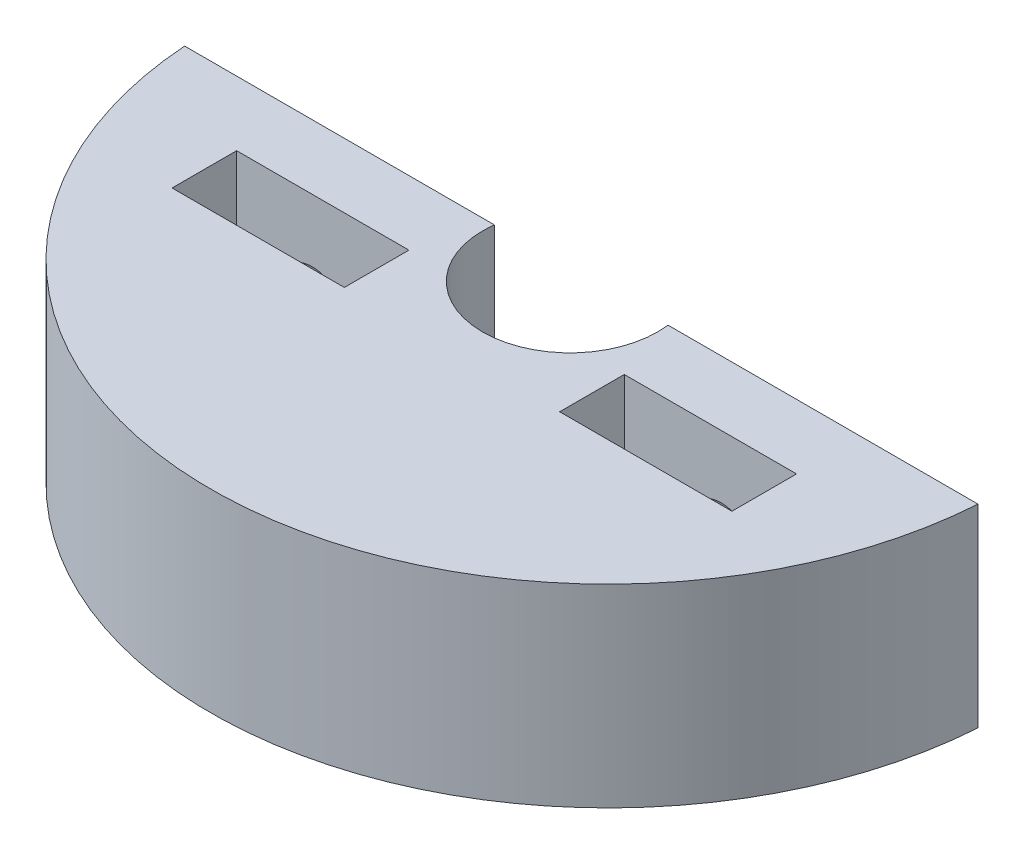
ISO-10303-21;
HEADER;
FILE_DESCRIPTION(('STEP AP214'),'2;1');
FILE_NAME('part.step','',(''),(''),'','','');
FILE_SCHEMA(('AUTOMOTIVE_DESIGN { 1 0 10303 214 1 1 1 1 }'));
ENDSEC;
DATA;
#1=APPLICATION_CONTEXT('core data for automotive mechanical design processes');
#2=APPLICATION_PROTOCOL_DEFINITION('international standard','automotive_design',2000,#1);
#3=PRODUCT_CONTEXT('',#1,'mechanical');
#4=PRODUCT('Part','Part','',(#3));
#5=PRODUCT_RELATED_PRODUCT_CATEGORY('part','',(#4));
#6=PRODUCT_DEFINITION_FORMATION('','',#4);
#7=PRODUCT_DEFINITION_CONTEXT('part definition',#1,'design');
#8=PRODUCT_DEFINITION('design','',#6,#7);
#9=PRODUCT_DEFINITION_SHAPE('','',#8);
#10=(LENGTH_UNIT() NAMED_UNIT(*) SI_UNIT(.MILLI.,.METRE.));
#11=(NAMED_UNIT(*) PLANE_ANGLE_UNIT() SI_UNIT($,.RADIAN.));
#12=(NAMED_UNIT(*) SI_UNIT($,.STERADIAN.) SOLID_ANGLE_UNIT());
#13=UNCERTAINTY_MEASURE_WITH_UNIT(LENGTH_MEASURE(1.E-05),#10,'distance_accuracy_value','');
#14=(GEOMETRIC_REPRESENTATION_CONTEXT(3) GLOBAL_UNCERTAINTY_ASSIGNED_CONTEXT((#13)) GLOBAL_UNIT_ASSIGNED_CONTEXT((#10,
#11,#12)) REPRESENTATION_CONTEXT('',''));
#15=CARTESIAN_POINT('',(0.,0.,0.));
#16=DIRECTION('',(0.,0.,1.));
#17=DIRECTION('',(1.,0.,0.));
#18=AXIS2_PLACEMENT_3D('',#15,#16,#17);
#19=CARTESIAN_POINT('',(43.755613948882,9.,-27.5186188295077));
#20=DIRECTION('',(0.,-1.,0.));
#21=DIRECTION('',(0.,0.,-1.));
#22=AXIS2_PLACEMENT_3D('',#19,#20,#21);
#23=CYLINDRICAL_SURFACE('',#22,18.4634264798173);
#24=CARTESIAN_POINT('',(43.755613948882,0.,-27.5186188295077));
#25=DIRECTION('',(0.,1.,0.));
#26=DIRECTION('',(0.,0.,1.));
#27=AXIS2_PLACEMENT_3D('',#24,#25,#26);
#28=CIRCLE('',#27,18.4634264798173);
#29=CARTESIAN_POINT('',(25.3345494471867,0.,-26.2686188295077));
#30=VERTEX_POINT('',#29);
#31=CARTESIAN_POINT('',(62.1766784505773,0.,-26.2686188295077));
#32=VERTEX_POINT('',#31);
#33=EDGE_CURVE('E200',#30,#32,#28,.T.);
#34=ORIENTED_EDGE('',*,*,#33,.T.);
#35=DIRECTION('',(0.,-1.,0.));
#36=VECTOR('',#35,1.);
#37=CARTESIAN_POINT('',(62.1766784505773,9.,-26.2686188295077));
#38=LINE('',#37,#36);
#39=CARTESIAN_POINT('',(62.1766784505773,9.,-26.2686188295077));
#40=VERTEX_POINT('',#39);
#41=EDGE_CURVE('E217',#40,#32,#38,.T.);
#42=ORIENTED_EDGE('',*,*,#41,.F.);
#43=CARTESIAN_POINT('',(43.755613948882,9.,-27.5186188295077));
#44=DIRECTION('',(0.,1.,0.));
#45=DIRECTION('',(0.,0.,1.));
#46=AXIS2_PLACEMENT_3D('',#43,#44,#45);
#47=CIRCLE('',#46,18.4634264798173);
#48=CARTESIAN_POINT('',(25.3345494471867,9.,-26.2686188295077));
#49=VERTEX_POINT('',#48);
#50=EDGE_CURVE('E189',#49,#40,#47,.T.);
#51=ORIENTED_EDGE('',*,*,#50,.F.);
#52=DIRECTION('',(0.,-1.,0.));
#53=VECTOR('',#52,1.);
#54=CARTESIAN_POINT('',(25.3345494471867,9.,-26.2686188295077));
#55=LINE('',#54,#53);
#56=EDGE_CURVE('E199',#49,#30,#55,.T.);
#57=ORIENTED_EDGE('',*,*,#56,.T.);
#58=EDGE_LOOP('',(#34,#42,#51,#57));
#59=FACE_BOUND('',#58,.T.);
#60=ADVANCED_FACE('F37',(#59),#23,.T.);
#61=CARTESIAN_POINT('',(47.7809975474761,9.,-26.2686188295077));
#62=DIRECTION('',(0.,0.,1.));
#63=DIRECTION('',(1.,0.,0.));
#64=AXIS2_PLACEMENT_3D('',#61,#62,#63);
#65=PLANE('',#64);
#66=CARTESIAN_POINT('',(53.2556139574761,4.50195927722872,-26.2686188295077));
#67=DIRECTION('',(0.,0.,1.));
#68=DIRECTION('',(1.,0.,0.));
#69=AXIS2_PLACEMENT_3D('',#66,#67,#68);
#70=CIRCLE('',#69,1.585);
#71=CARTESIAN_POINT('',(54.8406139574761,4.50195927722872,-26.2686188295077));
#72=VERTEX_POINT('',#71);
#73=EDGE_CURVE('E204',#72,#72,#70,.F.);
#74=ORIENTED_EDGE('',*,*,#73,.F.);
#75=EDGE_LOOP('',(#74));
#76=FACE_BOUND('',#75,.T.);
#77=DIRECTION('',(-1.,0.,0.));
#78=VECTOR('',#77,1.);
#79=CARTESIAN_POINT('',(47.7809975474761,0.,-26.2686188295077));
#80=LINE('',#79,#78);
#81=CARTESIAN_POINT('',(47.7809975474761,0.,-26.2686188295077));
#82=VERTEX_POINT('',#81);
#83=EDGE_CURVE('E203',#32,#82,#80,.T.);
#84=ORIENTED_EDGE('',*,*,#83,.T.);
#85=DIRECTION('',(0.,-1.,0.));
#86=VECTOR('',#85,1.);
#87=CARTESIAN_POINT('',(47.7809975474761,9.,-26.2686188295077));
#88=LINE('',#87,#86);
#89=CARTESIAN_POINT('',(47.7809975474761,9.,-26.2686188295077));
#90=VERTEX_POINT('',#89);
#91=EDGE_CURVE('E214',#90,#82,#88,.T.);
#92=ORIENTED_EDGE('',*,*,#91,.F.);
#93=DIRECTION('',(-1.,0.,0.));
#94=VECTOR('',#93,1.);
#95=CARTESIAN_POINT('',(47.7809975474761,9.,-26.2686188295077));
#96=LINE('',#95,#94);
#97=EDGE_CURVE('E192',#40,#90,#96,.T.);
#98=ORIENTED_EDGE('',*,*,#97,.F.);
#99=ORIENTED_EDGE('',*,*,#41,.T.);
#100=EDGE_LOOP('',(#84,#92,#98,#99));
#101=FACE_BOUND('',#100,.T.);
#102=ADVANCED_FACE('F252',(#76,#101),#65,.F.);
#103=CARTESIAN_POINT('',(43.7497527201918,9.,-25.7517945764645));
#104=DIRECTION('',(0.,-1.,0.));
#105=DIRECTION('',(0.,0.,-1.));
#106=AXIS2_PLACEMENT_3D('',#103,#104,#105);
#107=CYLINDRICAL_SURFACE('',#106,4.06423943266635);
#108=CARTESIAN_POINT('',(43.7497527201918,0.,-25.7517945764645));
#109=DIRECTION('',(0.,-1.,0.));
#110=DIRECTION('',(0.,0.,1.));
#111=AXIS2_PLACEMENT_3D('',#108,#109,#110);
#112=CIRCLE('',#111,4.06423943266635);
#113=CARTESIAN_POINT('',(39.7185078929075,0.,-26.2686188295077));
#114=VERTEX_POINT('',#113);
#115=EDGE_CURVE('E206',#82,#114,#112,.T.);
#116=ORIENTED_EDGE('',*,*,#115,.T.);
#117=DIRECTION('',(0.,-1.,0.));
#118=VECTOR('',#117,1.);
#119=CARTESIAN_POINT('',(39.7185078929075,9.,-26.2686188295077));
#120=LINE('',#119,#118);
#121=CARTESIAN_POINT('',(39.7185078929075,9.,-26.2686188295077));
#122=VERTEX_POINT('',#121);
#123=EDGE_CURVE('E211',#122,#114,#120,.T.);
#124=ORIENTED_EDGE('',*,*,#123,.F.);
#125=CARTESIAN_POINT('',(43.7497527201918,9.,-25.7517945764645));
#126=DIRECTION('',(0.,-1.,0.));
#127=DIRECTION('',(0.,0.,1.));
#128=AXIS2_PLACEMENT_3D('',#125,#126,#127);
#129=CIRCLE('',#128,4.06423943266635);
#130=EDGE_CURVE('E195',#90,#122,#129,.T.);
#131=ORIENTED_EDGE('',*,*,#130,.F.);
#132=ORIENTED_EDGE('',*,*,#91,.T.);
#133=EDGE_LOOP('',(#116,#124,#131,#132));
#134=FACE_BOUND('',#133,.T.);
#135=ADVANCED_FACE('F257',(#134),#107,.F.);
#136=CARTESIAN_POINT('',(25.3345494471867,9.,-26.2686188295077));
#137=DIRECTION('',(0.,0.,1.));
#138=DIRECTION('',(1.,0.,0.));
#139=AXIS2_PLACEMENT_3D('',#136,#137,#138);
#140=PLANE('',#139);
#141=CARTESIAN_POINT('',(34.2556139529075,4.50195927722872,-26.2686188295077));
#142=DIRECTION('',(0.,0.,1.));
#143=DIRECTION('',(1.,0.,0.));
#144=AXIS2_PLACEMENT_3D('',#141,#142,#143);
#145=CIRCLE('',#144,1.585);
#146=CARTESIAN_POINT('',(35.8406139529075,4.50195927722872,-26.2686188295077));
#147=VERTEX_POINT('',#146);
#148=EDGE_CURVE('E188',#147,#147,#145,.F.);
#149=ORIENTED_EDGE('',*,*,#148,.F.);
#150=EDGE_LOOP('',(#149));
#151=FACE_BOUND('',#150,.T.);
#152=DIRECTION('',(-1.,0.,0.));
#153=VECTOR('',#152,1.);
#154=CARTESIAN_POINT('',(25.3345494471867,0.,-26.2686188295077));
#155=LINE('',#154,#153);
#156=EDGE_CURVE('E193',#114,#30,#155,.T.);
#157=ORIENTED_EDGE('',*,*,#156,.T.);
#158=ORIENTED_EDGE('',*,*,#56,.F.);
#159=DIRECTION('',(-1.,0.,0.));
#160=VECTOR('',#159,1.);
#161=CARTESIAN_POINT('',(25.3345494471867,9.,-26.2686188295077));
#162=LINE('',#161,#160);
#163=EDGE_CURVE('E197',#122,#49,#162,.T.);
#164=ORIENTED_EDGE('',*,*,#163,.F.);
#165=ORIENTED_EDGE('',*,*,#123,.T.);
#166=EDGE_LOOP('',(#157,#158,#164,#165));
#167=FACE_BOUND('',#166,.T.);
#168=ADVANCED_FACE('F273',(#151,#167),#140,.F.);
#169=CARTESIAN_POINT('',(43.755613948882,9.,-27.5186188295077));
#170=DIRECTION('',(0.,1.,0.));
#171=DIRECTION('',(0.,0.,1.));
#172=AXIS2_PLACEMENT_3D('',#169,#170,#171);
#173=PLANE('',#172);
#174=DIRECTION('',(0.,0.,1.));
#175=VECTOR('',#174,1.);
#176=CARTESIAN_POINT('',(48.7497527201918,9.,-23.2686188295077));
#177=LINE('',#176,#175);
#178=CARTESIAN_POINT('',(48.7497527201918,9.,-23.2686188295077));
#179=VERTEX_POINT('',#178);
#180=CARTESIAN_POINT('',(48.7497527201918,9.,-20.2686188295077));
#181=VERTEX_POINT('',#180);
#182=EDGE_CURVE('E51',#179,#181,#177,.T.);
#183=ORIENTED_EDGE('',*,*,#182,.F.);
#184=DIRECTION('',(-1.,0.,0.));
#185=VECTOR('',#184,1.);
#186=CARTESIAN_POINT('',(48.7497527201918,9.,-23.2686188295077));
#187=LINE('',#186,#185);
#188=CARTESIAN_POINT('',(56.7497527201918,9.,-23.2686188295077));
#189=VERTEX_POINT('',#188);
#190=EDGE_CURVE('E148',#189,#179,#187,.T.);
#191=ORIENTED_EDGE('',*,*,#190,.F.);
#192=DIRECTION('',(0.,0.,-1.));
#193=VECTOR('',#192,1.);
#194=CARTESIAN_POINT('',(56.7497527201918,9.,-23.2686188295077));
#195=LINE('',#194,#193);
#196=CARTESIAN_POINT('',(56.7497527201918,9.,-20.2686188295077));
#197=VERTEX_POINT('',#196);
#198=EDGE_CURVE('E132',#197,#189,#195,.T.);
#199=ORIENTED_EDGE('',*,*,#198,.F.);
#200=DIRECTION('',(1.,0.,0.));
#201=VECTOR('',#200,1.);
#202=CARTESIAN_POINT('',(48.7497527201918,9.,-20.2686188295077));
#203=LINE('',#202,#201);
#204=EDGE_CURVE('E141',#181,#197,#203,.T.);
#205=ORIENTED_EDGE('',*,*,#204,.F.);
#206=EDGE_LOOP('',(#183,#191,#199,#205));
#207=FACE_BOUND('',#206,.T.);
#208=DIRECTION('',(0.,0.,-1.));
#209=VECTOR('',#208,1.);
#210=CARTESIAN_POINT('',(38.7497527201918,9.,-23.2686188295077));
#211=LINE('',#210,#209);
#212=CARTESIAN_POINT('',(38.7497527201918,9.,-20.2686188295077));
#213=VERTEX_POINT('',#212);
#214=CARTESIAN_POINT('',(38.7497527201918,9.,-23.2686188295077));
#215=VERTEX_POINT('',#214);
#216=EDGE_CURVE('E59',#213,#215,#211,.T.);
#217=ORIENTED_EDGE('',*,*,#216,.F.);
#218=DIRECTION('',(1.,0.,0.));
#219=VECTOR('',#218,1.);
#220=CARTESIAN_POINT('',(38.7497527201918,9.,-20.2686188295077));
#221=LINE('',#220,#219);
#222=CARTESIAN_POINT('',(30.7497527201918,9.,-20.2686188295077));
#223=VERTEX_POINT('',#222);
#224=EDGE_CURVE('E160',#223,#213,#221,.T.);
#225=ORIENTED_EDGE('',*,*,#224,.F.);
#226=DIRECTION('',(0.,0.,1.));
#227=VECTOR('',#226,1.);
#228=CARTESIAN_POINT('',(30.7497527201918,9.,-23.2686188295077));
#229=LINE('',#228,#227);
#230=CARTESIAN_POINT('',(30.7497527201918,9.,-23.2686188295077));
#231=VERTEX_POINT('',#230);
#232=EDGE_CURVE('E169',#231,#223,#229,.T.);
#233=ORIENTED_EDGE('',*,*,#232,.F.);
#234=DIRECTION('',(-1.,0.,0.));
#235=VECTOR('',#234,1.);
#236=CARTESIAN_POINT('',(38.7497527201918,9.,-23.2686188295077));
#237=LINE('',#236,#235);
#238=EDGE_CURVE('E172',#215,#231,#237,.T.);
#239=ORIENTED_EDGE('',*,*,#238,.F.);
#240=EDGE_LOOP('',(#217,#225,#233,#239));
#241=FACE_BOUND('',#240,.T.);
#242=ORIENTED_EDGE('',*,*,#50,.T.);
#243=ORIENTED_EDGE('',*,*,#97,.T.);
#244=ORIENTED_EDGE('',*,*,#130,.T.);
#245=ORIENTED_EDGE('',*,*,#163,.T.);
#246=EDGE_LOOP('',(#242,#243,#244,#245));
#247=FACE_BOUND('',#246,.T.);
#248=ADVANCED_FACE('F145',(#207,#241,#247),#173,.T.);
#249=CARTESIAN_POINT('',(43.755613948882,0.,-27.5186188295077));
#250=DIRECTION('',(0.,1.,0.));
#251=DIRECTION('',(0.,0.,1.));
#252=AXIS2_PLACEMENT_3D('',#249,#250,#251);
#253=PLANE('',#252);
#254=DIRECTION('',(-1.,0.,0.));
#255=VECTOR('',#254,1.);
#256=CARTESIAN_POINT('',(43.755613948882,0.,-23.2686188295077));
#257=LINE('',#256,#255);
#258=CARTESIAN_POINT('',(56.7497527201918,0.,-23.2686188295077));
#259=VERTEX_POINT('',#258);
#260=CARTESIAN_POINT('',(48.7497527201918,0.,-23.2686188295077));
#261=VERTEX_POINT('',#260);
#262=EDGE_CURVE('E178',#259,#261,#257,.T.);
#263=ORIENTED_EDGE('',*,*,#262,.T.);
#264=DIRECTION('',(0.,0.,1.));
#265=VECTOR('',#264,1.);
#266=CARTESIAN_POINT('',(48.7497527201918,0.,-27.5186188295077));
#267=LINE('',#266,#265);
#268=CARTESIAN_POINT('',(48.7497527201918,0.,-20.2686188295077));
#269=VERTEX_POINT('',#268);
#270=EDGE_CURVE('E11',#261,#269,#267,.T.);
#271=ORIENTED_EDGE('',*,*,#270,.T.);
#272=DIRECTION('',(1.,0.,0.));
#273=VECTOR('',#272,1.);
#274=CARTESIAN_POINT('',(43.755613948882,0.,-20.2686188295077));
#275=LINE('',#274,#273);
#276=CARTESIAN_POINT('',(56.7497527201918,0.,-20.2686188295077));
#277=VERTEX_POINT('',#276);
#278=EDGE_CURVE('E155',#269,#277,#275,.T.);
#279=ORIENTED_EDGE('',*,*,#278,.T.);
#280=DIRECTION('',(0.,0.,-1.));
#281=VECTOR('',#280,1.);
#282=CARTESIAN_POINT('',(56.7497527201918,0.,-27.5186188295077));
#283=LINE('',#282,#281);
#284=EDGE_CURVE('E44',#277,#259,#283,.T.);
#285=ORIENTED_EDGE('',*,*,#284,.T.);
#286=EDGE_LOOP('',(#263,#271,#279,#285));
#287=FACE_BOUND('',#286,.T.);
#288=DIRECTION('',(1.,0.,0.));
#289=VECTOR('',#288,1.);
#290=CARTESIAN_POINT('',(43.755613948882,0.,-20.2686188295077));
#291=LINE('',#290,#289);
#292=CARTESIAN_POINT('',(30.7497527201918,0.,-20.2686188295077));
#293=VERTEX_POINT('',#292);
#294=CARTESIAN_POINT('',(38.7497527201918,0.,-20.2686188295077));
#295=VERTEX_POINT('',#294);
#296=EDGE_CURVE('E185',#293,#295,#291,.T.);
#297=ORIENTED_EDGE('',*,*,#296,.T.);
#298=DIRECTION('',(0.,0.,-1.));
#299=VECTOR('',#298,1.);
#300=CARTESIAN_POINT('',(38.7497527201918,0.,-27.5186188295077));
#301=LINE('',#300,#299);
#302=CARTESIAN_POINT('',(38.7497527201918,0.,-23.2686188295077));
#303=VERTEX_POINT('',#302);
#304=EDGE_CURVE('E231',#295,#303,#301,.T.);
#305=ORIENTED_EDGE('',*,*,#304,.T.);
#306=DIRECTION('',(-1.,0.,0.));
#307=VECTOR('',#306,1.);
#308=CARTESIAN_POINT('',(43.755613948882,0.,-23.2686188295077));
#309=LINE('',#308,#307);
#310=CARTESIAN_POINT('',(30.7497527201918,0.,-23.2686188295077));
#311=VERTEX_POINT('',#310);
#312=EDGE_CURVE('E182',#303,#311,#309,.T.);
#313=ORIENTED_EDGE('',*,*,#312,.T.);
#314=DIRECTION('',(0.,0.,1.));
#315=VECTOR('',#314,1.);
#316=CARTESIAN_POINT('',(30.7497527201918,0.,-27.5186188295077));
#317=LINE('',#316,#315);
#318=EDGE_CURVE('E220',#311,#293,#317,.T.);
#319=ORIENTED_EDGE('',*,*,#318,.T.);
#320=EDGE_LOOP('',(#297,#305,#313,#319));
#321=FACE_BOUND('',#320,.T.);
#322=ORIENTED_EDGE('',*,*,#33,.F.);
#323=ORIENTED_EDGE('',*,*,#156,.F.);
#324=ORIENTED_EDGE('',*,*,#115,.F.);
#325=ORIENTED_EDGE('',*,*,#83,.F.);
#326=EDGE_LOOP('',(#322,#323,#324,#325));
#327=FACE_BOUND('',#326,.T.);
#328=ADVANCED_FACE('F234',(#287,#321,#327),#253,.F.);
#329=CARTESIAN_POINT('',(34.2556139529075,4.50195927722872,-20.2686188295077));
#330=DIRECTION('',(0.,0.,-1.));
#331=DIRECTION('',(-1.,0.,0.));
#332=AXIS2_PLACEMENT_3D('',#329,#330,#331);
#333=CYLINDRICAL_SURFACE('',#332,1.585);
#334=CARTESIAN_POINT('',(34.2556139529075,4.50195927722872,-23.2686188295077));
#335=DIRECTION('',(0.,0.,-1.));
#336=DIRECTION('',(-1.,0.,0.));
#337=AXIS2_PLACEMENT_3D('',#334,#335,#336);
#338=CIRCLE('',#337,1.585);
#339=CARTESIAN_POINT('',(32.6706139529075,4.50195927722872,-23.2686188295077));
#340=VERTEX_POINT('',#339);
#341=EDGE_CURVE('E181',#340,#340,#338,.T.);
#342=ORIENTED_EDGE('',*,*,#341,.F.);
#343=EDGE_LOOP('',(#342));
#344=FACE_BOUND('',#343,.T.);
#345=ORIENTED_EDGE('',*,*,#148,.T.);
#346=EDGE_LOOP('',(#345));
#347=FACE_BOUND('',#346,.T.);
#348=ADVANCED_FACE('F285',(#344,#347),#333,.F.);
#349=CARTESIAN_POINT('',(53.2556139574761,4.50195927722872,-20.2686188295077));
#350=DIRECTION('',(0.,0.,-1.));
#351=DIRECTION('',(-1.,0.,0.));
#352=AXIS2_PLACEMENT_3D('',#349,#350,#351);
#353=CYLINDRICAL_SURFACE('',#352,1.585);
#354=CARTESIAN_POINT('',(53.2556139574761,4.50195927722872,-23.2686188295077));
#355=DIRECTION('',(0.,0.,-1.));
#356=DIRECTION('',(-1.,0.,0.));
#357=AXIS2_PLACEMENT_3D('',#354,#355,#356);
#358=CIRCLE('',#357,1.585);
#359=CARTESIAN_POINT('',(51.6706139574761,4.50195927722872,-23.2686188295077));
#360=VERTEX_POINT('',#359);
#361=EDGE_CURVE('E177',#360,#360,#358,.T.);
#362=ORIENTED_EDGE('',*,*,#361,.F.);
#363=EDGE_LOOP('',(#362));
#364=FACE_BOUND('',#363,.T.);
#365=ORIENTED_EDGE('',*,*,#73,.T.);
#366=EDGE_LOOP('',(#365));
#367=FACE_BOUND('',#366,.T.);
#368=ADVANCED_FACE('F295',(#364,#367),#353,.F.);
#369=CARTESIAN_POINT('',(48.7497527201918,-23.,-23.2686188295077));
#370=DIRECTION('',(-1.,0.,0.));
#371=DIRECTION('',(0.,0.,1.));
#372=AXIS2_PLACEMENT_3D('',#369,#370,#371);
#373=PLANE('',#372);
#374=DIRECTION('',(0.,1.,0.));
#375=VECTOR('',#374,1.);
#376=CARTESIAN_POINT('',(48.7497527201918,-23.,-23.2686188295077));
#377=LINE('',#376,#375);
#378=EDGE_CURVE('E153',#261,#179,#377,.T.);
#379=ORIENTED_EDGE('',*,*,#378,.T.);
#380=ORIENTED_EDGE('',*,*,#182,.T.);
#381=DIRECTION('',(0.,1.,0.));
#382=VECTOR('',#381,1.);
#383=CARTESIAN_POINT('',(48.7497527201918,-23.,-20.2686188295077));
#384=LINE('',#383,#382);
#385=EDGE_CURVE('E138',#269,#181,#384,.T.);
#386=ORIENTED_EDGE('',*,*,#385,.F.);
#387=ORIENTED_EDGE('',*,*,#270,.F.);
#388=EDGE_LOOP('',(#379,#380,#386,#387));
#389=FACE_BOUND('',#388,.T.);
#390=ADVANCED_FACE('F236',(#389),#373,.F.);
#391=CARTESIAN_POINT('',(56.7497527201918,-23.,-23.2686188295077));
#392=DIRECTION('',(1.,0.,0.));
#393=DIRECTION('',(0.,0.,-1.));
#394=AXIS2_PLACEMENT_3D('',#391,#392,#393);
#395=PLANE('',#394);
#396=DIRECTION('',(0.,1.,0.));
#397=VECTOR('',#396,1.);
#398=CARTESIAN_POINT('',(56.7497527201918,-23.,-20.2686188295077));
#399=LINE('',#398,#397);
#400=EDGE_CURVE('E127',#277,#197,#399,.T.);
#401=ORIENTED_EDGE('',*,*,#400,.T.);
#402=ORIENTED_EDGE('',*,*,#198,.T.);
#403=DIRECTION('',(0.,1.,0.));
#404=VECTOR('',#403,1.);
#405=CARTESIAN_POINT('',(56.7497527201918,-23.,-23.2686188295077));
#406=LINE('',#405,#404);
#407=EDGE_CURVE('E137',#259,#189,#406,.T.);
#408=ORIENTED_EDGE('',*,*,#407,.F.);
#409=ORIENTED_EDGE('',*,*,#284,.F.);
#410=EDGE_LOOP('',(#401,#402,#408,#409));
#411=FACE_BOUND('',#410,.T.);
#412=ADVANCED_FACE('F129',(#411),#395,.F.);
#413=CARTESIAN_POINT('',(48.7497527201918,-23.,-23.2686188295077));
#414=DIRECTION('',(0.,0.,-1.));
#415=DIRECTION('',(-1.,0.,0.));
#416=AXIS2_PLACEMENT_3D('',#413,#414,#415);
#417=PLANE('',#416);
#418=ORIENTED_EDGE('',*,*,#361,.T.);
#419=EDGE_LOOP('',(#418));
#420=FACE_BOUND('',#419,.T.);
#421=ORIENTED_EDGE('',*,*,#407,.T.);
#422=ORIENTED_EDGE('',*,*,#190,.T.);
#423=ORIENTED_EDGE('',*,*,#378,.F.);
#424=ORIENTED_EDGE('',*,*,#262,.F.);
#425=EDGE_LOOP('',(#421,#422,#423,#424));
#426=FACE_BOUND('',#425,.T.);
#427=ADVANCED_FACE('F239',(#420,#426),#417,.F.);
#428=CARTESIAN_POINT('',(38.7497527201918,-23.,-23.2686188295077));
#429=DIRECTION('',(1.,0.,0.));
#430=DIRECTION('',(0.,0.,-1.));
#431=AXIS2_PLACEMENT_3D('',#428,#429,#430);
#432=PLANE('',#431);
#433=DIRECTION('',(0.,1.,0.));
#434=VECTOR('',#433,1.);
#435=CARTESIAN_POINT('',(38.7497527201918,-23.,-20.2686188295077));
#436=LINE('',#435,#434);
#437=EDGE_CURVE('E165',#295,#213,#436,.T.);
#438=ORIENTED_EDGE('',*,*,#437,.T.);
#439=ORIENTED_EDGE('',*,*,#216,.T.);
#440=DIRECTION('',(0.,1.,0.));
#441=VECTOR('',#440,1.);
#442=CARTESIAN_POINT('',(38.7497527201918,-23.,-23.2686188295077));
#443=LINE('',#442,#441);
#444=EDGE_CURVE('E158',#303,#215,#443,.T.);
#445=ORIENTED_EDGE('',*,*,#444,.F.);
#446=ORIENTED_EDGE('',*,*,#304,.F.);
#447=EDGE_LOOP('',(#438,#439,#445,#446));
#448=FACE_BOUND('',#447,.T.);
#449=ADVANCED_FACE('F241',(#448),#432,.F.);
#450=CARTESIAN_POINT('',(30.7497527201918,-23.,-23.2686188295077));
#451=DIRECTION('',(-1.,0.,0.));
#452=DIRECTION('',(0.,0.,1.));
#453=AXIS2_PLACEMENT_3D('',#450,#451,#452);
#454=PLANE('',#453);
#455=DIRECTION('',(0.,1.,0.));
#456=VECTOR('',#455,1.);
#457=CARTESIAN_POINT('',(30.7497527201918,-23.,-23.2686188295077));
#458=LINE('',#457,#456);
#459=EDGE_CURVE('E161',#311,#231,#458,.T.);
#460=ORIENTED_EDGE('',*,*,#459,.T.);
#461=ORIENTED_EDGE('',*,*,#232,.T.);
#462=DIRECTION('',(0.,1.,0.));
#463=VECTOR('',#462,1.);
#464=CARTESIAN_POINT('',(30.7497527201918,-23.,-20.2686188295077));
#465=LINE('',#464,#463);
#466=EDGE_CURVE('E163',#293,#223,#465,.T.);
#467=ORIENTED_EDGE('',*,*,#466,.F.);
#468=ORIENTED_EDGE('',*,*,#318,.F.);
#469=EDGE_LOOP('',(#460,#461,#467,#468));
#470=FACE_BOUND('',#469,.T.);
#471=ADVANCED_FACE('F248',(#470),#454,.F.);
#472=CARTESIAN_POINT('',(38.7497527201918,-23.,-23.2686188295077));
#473=DIRECTION('',(0.,0.,-1.));
#474=DIRECTION('',(-1.,0.,0.));
#475=AXIS2_PLACEMENT_3D('',#472,#473,#474);
#476=PLANE('',#475);
#477=ORIENTED_EDGE('',*,*,#341,.T.);
#478=EDGE_LOOP('',(#477));
#479=FACE_BOUND('',#478,.T.);
#480=ORIENTED_EDGE('',*,*,#444,.T.);
#481=ORIENTED_EDGE('',*,*,#238,.T.);
#482=ORIENTED_EDGE('',*,*,#459,.F.);
#483=ORIENTED_EDGE('',*,*,#312,.F.);
#484=EDGE_LOOP('',(#480,#481,#482,#483));
#485=FACE_BOUND('',#484,.T.);
#486=ADVANCED_FACE('F291',(#479,#485),#476,.F.);
#487=CARTESIAN_POINT('',(34.2556139529075,4.50195927722872,-20.2686188295077));
#488=DIRECTION('',(0.,0.,1.));
#489=DIRECTION('',(1.,0.,0.));
#490=AXIS2_PLACEMENT_3D('',#487,#488,#489);
#491=PLANE('',#490);
#492=ORIENTED_EDGE('',*,*,#466,.T.);
#493=ORIENTED_EDGE('',*,*,#224,.T.);
#494=ORIENTED_EDGE('',*,*,#437,.F.);
#495=ORIENTED_EDGE('',*,*,#296,.F.);
#496=EDGE_LOOP('',(#492,#493,#494,#495));
#497=FACE_BOUND('',#496,.T.);
#498=ADVANCED_FACE('F288',(#497),#491,.F.);
#499=CARTESIAN_POINT('',(53.2556139574761,4.50195927722872,-20.2686188295077));
#500=DIRECTION('',(0.,0.,1.));
#501=DIRECTION('',(1.,0.,0.));
#502=AXIS2_PLACEMENT_3D('',#499,#500,#501);
#503=PLANE('',#502);
#504=ORIENTED_EDGE('',*,*,#385,.T.);
#505=ORIENTED_EDGE('',*,*,#204,.T.);
#506=ORIENTED_EDGE('',*,*,#400,.F.);
#507=ORIENTED_EDGE('',*,*,#278,.F.);
#508=EDGE_LOOP('',(#504,#505,#506,#507));
#509=FACE_BOUND('',#508,.T.);
#510=ADVANCED_FACE('F142',(#509),#503,.F.);
#511=CLOSED_SHELL('',(#60,#102,#135,#168,#248,#328,#348,#368,#390,#412,#427,#449,#471,#486,#498,#510));
#512=MANIFOLD_SOLID_BREP('B2',#511);
#513=ADVANCED_BREP_SHAPE_REPRESENTATION('',(#18,#512),#14);
#514=SHAPE_DEFINITION_REPRESENTATION(#9,#513);
ENDSEC;
END-ISO-10303-21;
